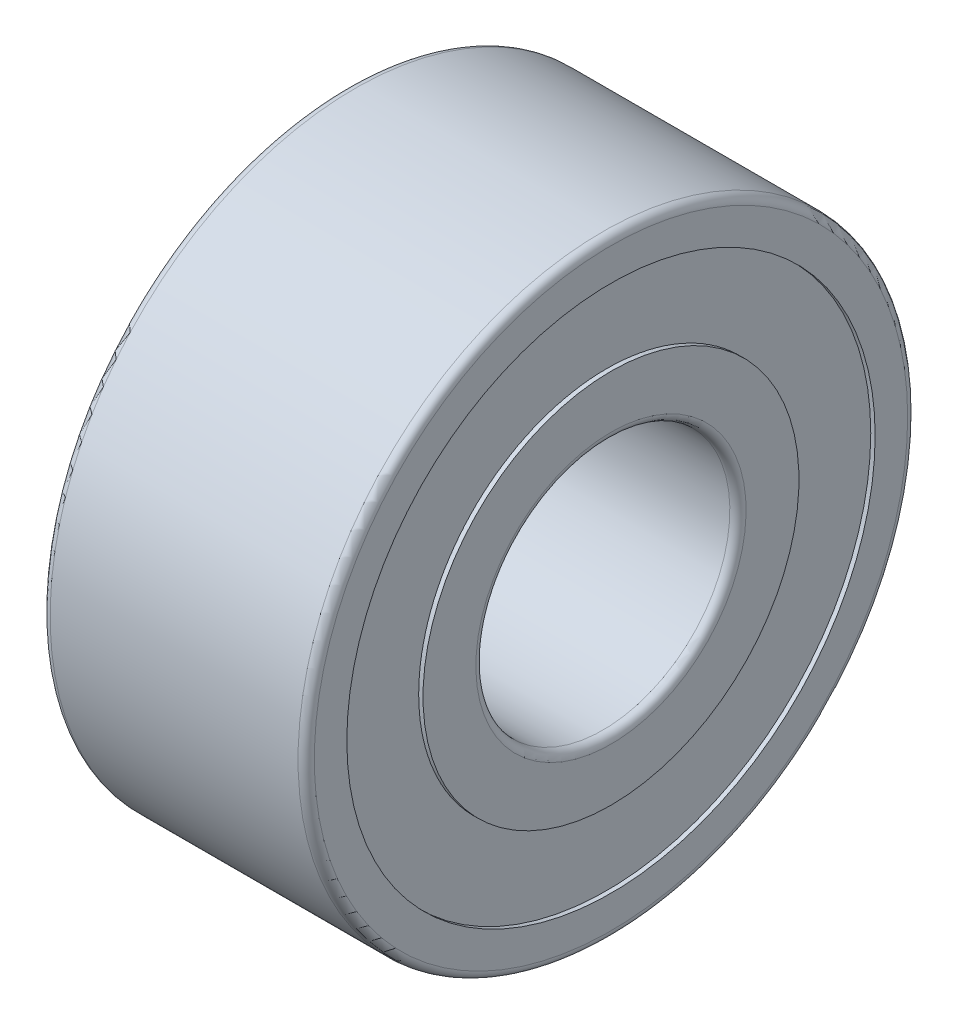
ISO-10303-21;
HEADER;
FILE_DESCRIPTION(('STEP AP214'),'2;1');
FILE_NAME('part.step','',(''),(''),'','','');
FILE_SCHEMA(('AUTOMOTIVE_DESIGN { 1 0 10303 214 1 1 1 1 }'));
ENDSEC;
DATA;
#1=APPLICATION_CONTEXT('core data for automotive mechanical design processes');
#2=APPLICATION_PROTOCOL_DEFINITION('international standard','automotive_design',2000,#1);
#3=PRODUCT_CONTEXT('',#1,'mechanical');
#4=PRODUCT('Part','Part','',(#3));
#5=PRODUCT_RELATED_PRODUCT_CATEGORY('part','',(#4));
#6=PRODUCT_DEFINITION_FORMATION('','',#4);
#7=PRODUCT_DEFINITION_CONTEXT('part definition',#1,'design');
#8=PRODUCT_DEFINITION('design','',#6,#7);
#9=PRODUCT_DEFINITION_SHAPE('','',#8);
#10=(LENGTH_UNIT() NAMED_UNIT(*) SI_UNIT(.MILLI.,.METRE.));
#11=(NAMED_UNIT(*) PLANE_ANGLE_UNIT() SI_UNIT($,.RADIAN.));
#12=(NAMED_UNIT(*) SI_UNIT($,.STERADIAN.) SOLID_ANGLE_UNIT());
#13=UNCERTAINTY_MEASURE_WITH_UNIT(LENGTH_MEASURE(1.E-05),#10,'distance_accuracy_value','');
#14=(GEOMETRIC_REPRESENTATION_CONTEXT(3) GLOBAL_UNCERTAINTY_ASSIGNED_CONTEXT((#13)) GLOBAL_UNIT_ASSIGNED_CONTEXT((#10,
#11,#12)) REPRESENTATION_CONTEXT('',''));
#15=CARTESIAN_POINT('',(0.,0.,0.));
#16=DIRECTION('',(0.,0.,1.));
#17=DIRECTION('',(1.,0.,0.));
#18=AXIS2_PLACEMENT_3D('',#15,#16,#17);
#19=CARTESIAN_POINT('',(1.3,0.,2.125));
#20=DIRECTION('',(1.,0.,0.));
#21=DIRECTION('',(0.,0.,-1.));
#22=AXIS2_PLACEMENT_3D('',#19,#20,#21);
#23=SPHERICAL_SURFACE('',#22,0.525);
#24=CARTESIAN_POINT('',(0.775,0.,2.125));
#25=VERTEX_POINT('',#24);
#26=VERTEX_LOOP('',#25);
#27=FACE_BOUND('',#26,.T.);
#28=CARTESIAN_POINT('',(1.825,0.,2.125));
#29=VERTEX_POINT('',#28);
#30=VERTEX_LOOP('',#29);
#31=FACE_BOUND('',#30,.T.);
#32=ADVANCED_FACE('P0_F15',(#27,#31),#23,.T.);
#33=CLOSED_SHELL('',(#32));
#34=MANIFOLD_SOLID_BREP('P0_B1',#33);
#35=CARTESIAN_POINT('',(1.3,1.2490436611215,1.7191611130468));
#36=DIRECTION('',(1.,0.,0.));
#37=DIRECTION('',(0.,0.,-1.));
#38=AXIS2_PLACEMENT_3D('',#35,#36,#37);
#39=SPHERICAL_SURFACE('',#38,0.525);
#40=CARTESIAN_POINT('',(0.775,1.2490436611215,1.7191611130468));
#41=VERTEX_POINT('',#40);
#42=VERTEX_LOOP('',#41);
#43=FACE_BOUND('',#42,.T.);
#44=CARTESIAN_POINT('',(1.825,1.2490436611215,1.7191611130468));
#45=VERTEX_POINT('',#44);
#46=VERTEX_LOOP('',#45);
#47=FACE_BOUND('',#46,.T.);
#48=ADVANCED_FACE('P1_F15',(#43,#47),#39,.T.);
#49=CLOSED_SHELL('',(#48));
#50=MANIFOLD_SOLID_BREP('P1_B1',#49);
#51=CARTESIAN_POINT('',(1.3,-1.2490436611215,1.7191611130468));
#52=DIRECTION('',(1.,0.,0.));
#53=DIRECTION('',(0.,0.,-1.));
#54=AXIS2_PLACEMENT_3D('',#51,#52,#53);
#55=SPHERICAL_SURFACE('',#54,0.525);
#56=CARTESIAN_POINT('',(0.775,-1.2490436611215,1.7191611130468));
#57=VERTEX_POINT('',#56);
#58=VERTEX_LOOP('',#57);
#59=FACE_BOUND('',#58,.T.);
#60=CARTESIAN_POINT('',(1.825,-1.2490436611215,1.7191611130468));
#61=VERTEX_POINT('',#60);
#62=VERTEX_LOOP('',#61);
#63=FACE_BOUND('',#62,.T.);
#64=ADVANCED_FACE('P2_F15',(#59,#63),#55,.T.);
#65=CLOSED_SHELL('',(#64));
#66=MANIFOLD_SOLID_BREP('P2_B1',#65);
#67=CARTESIAN_POINT('',(1.3,-2.0209950971272,0.65666111304676));
#68=DIRECTION('',(1.,0.,0.));
#69=DIRECTION('',(0.,0.,-1.));
#70=AXIS2_PLACEMENT_3D('',#67,#68,#69);
#71=SPHERICAL_SURFACE('',#70,0.525);
#72=CARTESIAN_POINT('',(0.775,-2.0209950971272,0.65666111304676));
#73=VERTEX_POINT('',#72);
#74=VERTEX_LOOP('',#73);
#75=FACE_BOUND('',#74,.T.);
#76=CARTESIAN_POINT('',(1.825,-2.0209950971272,0.65666111304676));
#77=VERTEX_POINT('',#76);
#78=VERTEX_LOOP('',#77);
#79=FACE_BOUND('',#78,.T.);
#80=ADVANCED_FACE('P3_F15',(#75,#79),#71,.T.);
#81=CLOSED_SHELL('',(#80));
#82=MANIFOLD_SOLID_BREP('P3_B1',#81);
#83=CARTESIAN_POINT('',(1.3,-2.0209950971272,-0.65666111304676));
#84=DIRECTION('',(1.,0.,0.));
#85=DIRECTION('',(0.,0.,-1.));
#86=AXIS2_PLACEMENT_3D('',#83,#84,#85);
#87=SPHERICAL_SURFACE('',#86,0.525);
#88=CARTESIAN_POINT('',(0.775,-2.0209950971272,-0.65666111304676));
#89=VERTEX_POINT('',#88);
#90=VERTEX_LOOP('',#89);
#91=FACE_BOUND('',#90,.T.);
#92=CARTESIAN_POINT('',(1.825,-2.0209950971272,-0.65666111304676));
#93=VERTEX_POINT('',#92);
#94=VERTEX_LOOP('',#93);
#95=FACE_BOUND('',#94,.T.);
#96=ADVANCED_FACE('P4_F15',(#91,#95),#87,.T.);
#97=CLOSED_SHELL('',(#96));
#98=MANIFOLD_SOLID_BREP('P4_B1',#97);
#99=CARTESIAN_POINT('',(1.3,-1.2490436611215,-1.7191611130468));
#100=DIRECTION('',(1.,0.,0.));
#101=DIRECTION('',(0.,0.,-1.));
#102=AXIS2_PLACEMENT_3D('',#99,#100,#101);
#103=SPHERICAL_SURFACE('',#102,0.525);
#104=CARTESIAN_POINT('',(0.775,-1.2490436611215,-1.7191611130468));
#105=VERTEX_POINT('',#104);
#106=VERTEX_LOOP('',#105);
#107=FACE_BOUND('',#106,.T.);
#108=CARTESIAN_POINT('',(1.825,-1.2490436611215,-1.7191611130468));
#109=VERTEX_POINT('',#108);
#110=VERTEX_LOOP('',#109);
#111=FACE_BOUND('',#110,.T.);
#112=ADVANCED_FACE('P5_F15',(#107,#111),#103,.T.);
#113=CLOSED_SHELL('',(#112));
#114=MANIFOLD_SOLID_BREP('P5_B1',#113);
#115=CARTESIAN_POINT('',(1.3,0.,-2.125));
#116=DIRECTION('',(1.,0.,0.));
#117=DIRECTION('',(0.,0.,-1.));
#118=AXIS2_PLACEMENT_3D('',#115,#116,#117);
#119=SPHERICAL_SURFACE('',#118,0.525);
#120=CARTESIAN_POINT('',(0.775,0.,-2.125));
#121=VERTEX_POINT('',#120);
#122=VERTEX_LOOP('',#121);
#123=FACE_BOUND('',#122,.T.);
#124=CARTESIAN_POINT('',(1.825,0.,-2.125));
#125=VERTEX_POINT('',#124);
#126=VERTEX_LOOP('',#125);
#127=FACE_BOUND('',#126,.T.);
#128=ADVANCED_FACE('P6_F15',(#123,#127),#119,.T.);
#129=CLOSED_SHELL('',(#128));
#130=MANIFOLD_SOLID_BREP('P6_B1',#129);
#131=CARTESIAN_POINT('',(1.3,1.2490436611215,-1.7191611130468));
#132=DIRECTION('',(1.,0.,0.));
#133=DIRECTION('',(0.,0.,-1.));
#134=AXIS2_PLACEMENT_3D('',#131,#132,#133);
#135=SPHERICAL_SURFACE('',#134,0.525);
#136=CARTESIAN_POINT('',(0.775,1.2490436611215,-1.7191611130468));
#137=VERTEX_POINT('',#136);
#138=VERTEX_LOOP('',#137);
#139=FACE_BOUND('',#138,.T.);
#140=CARTESIAN_POINT('',(1.825,1.2490436611215,-1.7191611130468));
#141=VERTEX_POINT('',#140);
#142=VERTEX_LOOP('',#141);
#143=FACE_BOUND('',#142,.T.);
#144=ADVANCED_FACE('P7_F15',(#139,#143),#135,.T.);
#145=CLOSED_SHELL('',(#144));
#146=MANIFOLD_SOLID_BREP('P7_B1',#145);
#147=CARTESIAN_POINT('',(1.3,2.0209950971272,-0.65666111304676));
#148=DIRECTION('',(1.,0.,0.));
#149=DIRECTION('',(0.,0.,-1.));
#150=AXIS2_PLACEMENT_3D('',#147,#148,#149);
#151=SPHERICAL_SURFACE('',#150,0.525);
#152=CARTESIAN_POINT('',(0.775,2.0209950971272,-0.65666111304676));
#153=VERTEX_POINT('',#152);
#154=VERTEX_LOOP('',#153);
#155=FACE_BOUND('',#154,.T.);
#156=CARTESIAN_POINT('',(1.825,2.0209950971272,-0.65666111304676));
#157=VERTEX_POINT('',#156);
#158=VERTEX_LOOP('',#157);
#159=FACE_BOUND('',#158,.T.);
#160=ADVANCED_FACE('P8_F15',(#155,#159),#151,.T.);
#161=CLOSED_SHELL('',(#160));
#162=MANIFOLD_SOLID_BREP('P8_B1',#161);
#163=CARTESIAN_POINT('',(1.3,2.0209950971272,0.65666111304676));
#164=DIRECTION('',(1.,0.,0.));
#165=DIRECTION('',(0.,0.,-1.));
#166=AXIS2_PLACEMENT_3D('',#163,#164,#165);
#167=SPHERICAL_SURFACE('',#166,0.525);
#168=CARTESIAN_POINT('',(0.775,2.0209950971272,0.65666111304676));
#169=VERTEX_POINT('',#168);
#170=VERTEX_LOOP('',#169);
#171=FACE_BOUND('',#170,.T.);
#172=CARTESIAN_POINT('',(1.825,2.0209950971272,0.65666111304676));
#173=VERTEX_POINT('',#172);
#174=VERTEX_LOOP('',#173);
#175=FACE_BOUND('',#174,.T.);
#176=ADVANCED_FACE('P9_F15',(#171,#175),#167,.T.);
#177=CLOSED_SHELL('',(#176));
#178=MANIFOLD_SOLID_BREP('P9_B1',#177);
#179=CARTESIAN_POINT('',(0.,0.,1.85));
#180=DIRECTION('',(-1.,0.,0.));
#181=DIRECTION('',(0.,-1.,0.));
#182=AXIS2_PLACEMENT_3D('',#179,#180,#181);
#183=PLANE('',#182);
#184=CARTESIAN_POINT('',(0.,0.,0.));
#185=DIRECTION('',(1.,0.,0.));
#186=DIRECTION('',(0.,1.,0.));
#187=AXIS2_PLACEMENT_3D('',#184,#185,#186);
#188=CIRCLE('',#187,1.33000000000004);
#189=CARTESIAN_POINT('',(0.,1.33000000000004,0.));
#190=VERTEX_POINT('',#189);
#191=EDGE_CURVE('P10_E44',#190,#190,#188,.T.);
#192=ORIENTED_EDGE('',*,*,#191,.T.);
#193=EDGE_LOOP('',(#192));
#194=FACE_BOUND('',#193,.T.);
#195=CARTESIAN_POINT('',(0.,0.,0.));
#196=DIRECTION('',(1.,0.,0.));
#197=DIRECTION('',(0.,1.,0.));
#198=AXIS2_PLACEMENT_3D('',#195,#196,#197);
#199=CIRCLE('',#198,1.85);
#200=CARTESIAN_POINT('',(0.,1.85,0.));
#201=VERTEX_POINT('',#200);
#202=EDGE_CURVE('P10_E41',#201,#201,#199,.T.);
#203=ORIENTED_EDGE('',*,*,#202,.F.);
#204=EDGE_LOOP('',(#203));
#205=FACE_BOUND('',#204,.T.);
#206=ADVANCED_FACE('P10_F15',(#194,#205),#183,.T.);
#207=CARTESIAN_POINT('',(0.0800000000000401,0.,0.));
#208=DIRECTION('',(1.,0.,0.));
#209=DIRECTION('',(0.,1.,0.));
#210=AXIS2_PLACEMENT_3D('',#207,#208,#209);
#211=TOROIDAL_SURFACE('',#210,1.33000000000004,0.0800000000000401);
#212=CARTESIAN_POINT('',(0.08,0.,0.));
#213=DIRECTION('',(1.,0.,0.));
#214=DIRECTION('',(0.,1.,0.));
#215=AXIS2_PLACEMENT_3D('',#212,#213,#214);
#216=CIRCLE('',#215,1.25);
#217=CARTESIAN_POINT('',(0.08,1.25,0.));
#218=VERTEX_POINT('',#217);
#219=EDGE_CURVE('P10_E38',#218,#218,#216,.T.);
#220=ORIENTED_EDGE('',*,*,#219,.T.);
#221=EDGE_LOOP('',(#220));
#222=FACE_BOUND('',#221,.T.);
#223=ORIENTED_EDGE('',*,*,#191,.F.);
#224=EDGE_LOOP('',(#223));
#225=FACE_BOUND('',#224,.T.);
#226=ADVANCED_FACE('P10_F50',(#222,#225),#211,.T.);
#227=CARTESIAN_POINT('',(2.6,0.,0.));
#228=DIRECTION('',(1.,0.,0.));
#229=DIRECTION('',(0.,1.,0.));
#230=AXIS2_PLACEMENT_3D('',#227,#228,#229);
#231=CYLINDRICAL_SURFACE('',#230,1.85);
#232=ORIENTED_EDGE('',*,*,#202,.T.);
#233=EDGE_LOOP('',(#232));
#234=FACE_BOUND('',#233,.T.);
#235=CARTESIAN_POINT('',(0.85278640450004,0.,0.));
#236=DIRECTION('',(1.,0.,0.));
#237=DIRECTION('',(0.,1.,0.));
#238=AXIS2_PLACEMENT_3D('',#235,#236,#237);
#239=CIRCLE('',#238,1.85);
#240=CARTESIAN_POINT('',(0.85278640450004,1.85,0.));
#241=VERTEX_POINT('',#240);
#242=EDGE_CURVE('P10_E35',#241,#241,#239,.T.);
#243=ORIENTED_EDGE('',*,*,#242,.F.);
#244=EDGE_LOOP('',(#243));
#245=FACE_BOUND('',#244,.T.);
#246=ADVANCED_FACE('P10_F52',(#234,#245),#231,.T.);
#247=CARTESIAN_POINT('',(2.6,0.,0.));
#248=DIRECTION('',(1.,0.,0.));
#249=DIRECTION('',(0.,1.,0.));
#250=AXIS2_PLACEMENT_3D('',#247,#248,#249);
#251=CYLINDRICAL_SURFACE('',#250,1.25);
#252=CARTESIAN_POINT('',(2.52,0.,0.));
#253=DIRECTION('',(1.,0.,0.));
#254=DIRECTION('',(0.,1.,0.));
#255=AXIS2_PLACEMENT_3D('',#252,#253,#254);
#256=CIRCLE('',#255,1.25);
#257=CARTESIAN_POINT('',(2.52,1.25,0.));
#258=VERTEX_POINT('',#257);
#259=EDGE_CURVE('P10_E30',#258,#258,#256,.T.);
#260=ORIENTED_EDGE('',*,*,#259,.T.);
#261=EDGE_LOOP('',(#260));
#262=FACE_BOUND('',#261,.T.);
#263=ORIENTED_EDGE('',*,*,#219,.F.);
#264=EDGE_LOOP('',(#263));
#265=FACE_BOUND('',#264,.T.);
#266=ADVANCED_FACE('P10_F60',(#262,#265),#251,.F.);
#267=CARTESIAN_POINT('',(1.30000000000002,0.,0.));
#268=DIRECTION('',(1.,0.,0.));
#269=DIRECTION('',(0.,1.,0.));
#270=AXIS2_PLACEMENT_3D('',#267,#268,#269);
#271=TOROIDAL_SURFACE('',#270,2.12500000000004,0.52500000000004);
#272=CARTESIAN_POINT('',(1.7472135955,0.,0.));
#273=DIRECTION('',(1.,0.,0.));
#274=DIRECTION('',(0.,1.,0.));
#275=AXIS2_PLACEMENT_3D('',#272,#273,#274);
#276=CIRCLE('',#275,1.85);
#277=CARTESIAN_POINT('',(1.7472135955,1.85,0.));
#278=VERTEX_POINT('',#277);
#279=EDGE_CURVE('P10_E26',#278,#278,#276,.T.);
#280=ORIENTED_EDGE('',*,*,#279,.F.);
#281=EDGE_LOOP('',(#280));
#282=FACE_BOUND('',#281,.T.);
#283=ORIENTED_EDGE('',*,*,#242,.T.);
#284=EDGE_LOOP('',(#283));
#285=FACE_BOUND('',#284,.T.);
#286=ADVANCED_FACE('P10_F67',(#282,#285),#271,.F.);
#287=CARTESIAN_POINT('',(2.51999999999992,0.,0.));
#288=DIRECTION('',(1.,0.,0.));
#289=DIRECTION('',(0.,1.,0.));
#290=AXIS2_PLACEMENT_3D('',#287,#288,#289);
#291=TOROIDAL_SURFACE('',#290,1.33000000000008,0.0800000000000813);
#292=CARTESIAN_POINT('',(2.6,0.,0.));
#293=DIRECTION('',(1.,0.,0.));
#294=DIRECTION('',(0.,1.,0.));
#295=AXIS2_PLACEMENT_3D('',#292,#293,#294);
#296=CIRCLE('',#295,1.32999998564538);
#297=CARTESIAN_POINT('',(2.6,1.32999998564538,0.));
#298=VERTEX_POINT('',#297);
#299=EDGE_CURVE('P10_E22',#298,#298,#296,.T.);
#300=ORIENTED_EDGE('',*,*,#299,.T.);
#301=EDGE_LOOP('',(#300));
#302=FACE_BOUND('',#301,.T.);
#303=ORIENTED_EDGE('',*,*,#259,.F.);
#304=EDGE_LOOP('',(#303));
#305=FACE_BOUND('',#304,.T.);
#306=ADVANCED_FACE('P10_F71',(#302,#305),#291,.T.);
#307=CARTESIAN_POINT('',(2.6,0.,0.));
#308=DIRECTION('',(1.,0.,0.));
#309=DIRECTION('',(0.,1.,0.));
#310=AXIS2_PLACEMENT_3D('',#307,#308,#309);
#311=CYLINDRICAL_SURFACE('',#310,1.85);
#312=ORIENTED_EDGE('',*,*,#279,.T.);
#313=EDGE_LOOP('',(#312));
#314=FACE_BOUND('',#313,.T.);
#315=CARTESIAN_POINT('',(2.6,0.,0.));
#316=DIRECTION('',(1.,0.,0.));
#317=DIRECTION('',(0.,1.,0.));
#318=AXIS2_PLACEMENT_3D('',#315,#316,#317);
#319=CIRCLE('',#318,1.85);
#320=CARTESIAN_POINT('',(2.6,1.85,0.));
#321=VERTEX_POINT('',#320);
#322=EDGE_CURVE('P10_E10',#321,#321,#319,.T.);
#323=ORIENTED_EDGE('',*,*,#322,.F.);
#324=EDGE_LOOP('',(#323));
#325=FACE_BOUND('',#324,.T.);
#326=ADVANCED_FACE('P10_F74',(#314,#325),#311,.T.);
#327=CARTESIAN_POINT('',(2.6,0.,1.33));
#328=DIRECTION('',(1.,0.,0.));
#329=DIRECTION('',(0.,1.,0.));
#330=AXIS2_PLACEMENT_3D('',#327,#328,#329);
#331=PLANE('',#330);
#332=ORIENTED_EDGE('',*,*,#322,.T.);
#333=EDGE_LOOP('',(#332));
#334=FACE_BOUND('',#333,.T.);
#335=ORIENTED_EDGE('',*,*,#299,.F.);
#336=EDGE_LOOP('',(#335));
#337=FACE_BOUND('',#336,.T.);
#338=ADVANCED_FACE('P10_F17',(#334,#337),#331,.T.);
#339=CLOSED_SHELL('',(#206,#226,#246,#266,#286,#306,#326,#338));
#340=MANIFOLD_SOLID_BREP('P10_B1',#339);
#341=CARTESIAN_POINT('',(0.,2.92,0.));
#342=DIRECTION('',(-1.,0.,0.));
#343=DIRECTION('',(0.,0.,1.));
#344=AXIS2_PLACEMENT_3D('',#341,#342,#343);
#345=PLANE('',#344);
#346=CARTESIAN_POINT('',(0.,0.,0.));
#347=DIRECTION('',(1.,0.,0.));
#348=DIRECTION('',(0.,0.,-1.));
#349=AXIS2_PLACEMENT_3D('',#346,#347,#348);
#350=CIRCLE('',#349,2.6);
#351=CARTESIAN_POINT('',(0.,0.,-2.6));
#352=VERTEX_POINT('',#351);
#353=EDGE_CURVE('P11_E56',#352,#352,#350,.T.);
#354=ORIENTED_EDGE('',*,*,#353,.T.);
#355=EDGE_LOOP('',(#354));
#356=FACE_BOUND('',#355,.T.);
#357=CARTESIAN_POINT('',(0.,0.,0.));
#358=DIRECTION('',(1.,0.,0.));
#359=DIRECTION('',(0.,0.,-1.));
#360=AXIS2_PLACEMENT_3D('',#357,#358,#359);
#361=CIRCLE('',#360,2.91999999999996);
#362=CARTESIAN_POINT('',(0.,0.,-2.91999999999996));
#363=VERTEX_POINT('',#362);
#364=EDGE_CURVE('P11_E53',#363,#363,#361,.T.);
#365=ORIENTED_EDGE('',*,*,#364,.F.);
#366=EDGE_LOOP('',(#365));
#367=FACE_BOUND('',#366,.T.);
#368=ADVANCED_FACE('P11_F15',(#356,#367),#345,.T.);
#369=CARTESIAN_POINT('',(2.6,0.,0.));
#370=DIRECTION('',(1.,0.,0.));
#371=DIRECTION('',(0.,0.,-1.));
#372=AXIS2_PLACEMENT_3D('',#369,#370,#371);
#373=CYLINDRICAL_SURFACE('',#372,2.6);
#374=CARTESIAN_POINT('',(0.17264,0.,0.));
#375=DIRECTION('',(1.,0.,0.));
#376=DIRECTION('',(0.,0.,-1.));
#377=AXIS2_PLACEMENT_3D('',#374,#375,#376);
#378=CIRCLE('',#377,2.6);
#379=CARTESIAN_POINT('',(0.17264,0.,-2.6));
#380=VERTEX_POINT('',#379);
#381=EDGE_CURVE('P11_E50',#380,#380,#378,.T.);
#382=ORIENTED_EDGE('',*,*,#381,.T.);
#383=EDGE_LOOP('',(#382));
#384=FACE_BOUND('',#383,.T.);
#385=ORIENTED_EDGE('',*,*,#353,.F.);
#386=EDGE_LOOP('',(#385));
#387=FACE_BOUND('',#386,.T.);
#388=ADVANCED_FACE('P11_F62',(#384,#387),#373,.F.);
#389=CARTESIAN_POINT('',(0.0800000000000406,0.,0.));
#390=DIRECTION('',(1.,0.,0.));
#391=DIRECTION('',(0.,0.,-1.));
#392=AXIS2_PLACEMENT_3D('',#389,#390,#391);
#393=TOROIDAL_SURFACE('',#392,2.91999999999996,0.0800000000000405);
#394=ORIENTED_EDGE('',*,*,#364,.T.);
#395=EDGE_LOOP('',(#394));
#396=FACE_BOUND('',#395,.T.);
#397=CARTESIAN_POINT('',(0.0800000000000001,0.,0.));
#398=DIRECTION('',(1.,0.,0.));
#399=DIRECTION('',(0.,0.,-1.));
#400=AXIS2_PLACEMENT_3D('',#397,#398,#399);
#401=CIRCLE('',#400,3.);
#402=CARTESIAN_POINT('',(0.0800000000000001,0.,-3.));
#403=VERTEX_POINT('',#402);
#404=EDGE_CURVE('P11_E47',#403,#403,#401,.T.);
#405=ORIENTED_EDGE('',*,*,#404,.F.);
#406=EDGE_LOOP('',(#405));
#407=FACE_BOUND('',#406,.T.);
#408=ADVANCED_FACE('P11_F64',(#396,#407),#393,.T.);
#409=CARTESIAN_POINT('',(0.17264,2.6,0.));
#410=DIRECTION('',(-1.,0.,0.));
#411=DIRECTION('',(0.,0.,1.));
#412=AXIS2_PLACEMENT_3D('',#409,#410,#411);
#413=PLANE('',#412);
#414=CARTESIAN_POINT('',(0.17264,0.,0.));
#415=DIRECTION('',(1.,0.,0.));
#416=DIRECTION('',(0.,0.,-1.));
#417=AXIS2_PLACEMENT_3D('',#414,#415,#416);
#418=CIRCLE('',#417,2.45);
#419=CARTESIAN_POINT('',(0.17264,0.,-2.45));
#420=VERTEX_POINT('',#419);
#421=EDGE_CURVE('P11_E44',#420,#420,#418,.T.);
#422=ORIENTED_EDGE('',*,*,#421,.T.);
#423=EDGE_LOOP('',(#422));
#424=FACE_BOUND('',#423,.T.);
#425=ORIENTED_EDGE('',*,*,#381,.F.);
#426=EDGE_LOOP('',(#425));
#427=FACE_BOUND('',#426,.T.);
#428=ADVANCED_FACE('P11_F73',(#424,#427),#413,.T.);
#429=CARTESIAN_POINT('',(2.6,0.,0.));
#430=DIRECTION('',(1.,0.,0.));
#431=DIRECTION('',(0.,0.,-1.));
#432=AXIS2_PLACEMENT_3D('',#429,#430,#431);
#433=CYLINDRICAL_SURFACE('',#432,3.);
#434=ORIENTED_EDGE('',*,*,#404,.T.);
#435=EDGE_LOOP('',(#434));
#436=FACE_BOUND('',#435,.T.);
#437=CARTESIAN_POINT('',(2.52,0.,0.));
#438=DIRECTION('',(1.,0.,0.));
#439=DIRECTION('',(0.,0.,-1.));
#440=AXIS2_PLACEMENT_3D('',#437,#438,#439);
#441=CIRCLE('',#440,3.);
#442=CARTESIAN_POINT('',(2.52,0.,-3.));
#443=VERTEX_POINT('',#442);
#444=EDGE_CURVE('P11_E41',#443,#443,#441,.T.);
#445=ORIENTED_EDGE('',*,*,#444,.F.);
#446=EDGE_LOOP('',(#445));
#447=FACE_BOUND('',#446,.T.);
#448=ADVANCED_FACE('P11_F80',(#436,#447),#433,.T.);
#449=CARTESIAN_POINT('',(2.6,0.,0.));
#450=DIRECTION('',(1.,0.,0.));
#451=DIRECTION('',(0.,0.,-1.));
#452=AXIS2_PLACEMENT_3D('',#449,#450,#451);
#453=CYLINDRICAL_SURFACE('',#452,2.45);
#454=CARTESIAN_POINT('',(0.88768943743823,0.,0.));
#455=DIRECTION('',(1.,0.,0.));
#456=DIRECTION('',(0.,0.,-1.));
#457=AXIS2_PLACEMENT_3D('',#454,#455,#456);
#458=CIRCLE('',#457,2.45);
#459=CARTESIAN_POINT('',(0.88768943743823,0.,-2.45));
#460=VERTEX_POINT('',#459);
#461=EDGE_CURVE('P11_E38',#460,#460,#458,.T.);
#462=ORIENTED_EDGE('',*,*,#461,.T.);
#463=EDGE_LOOP('',(#462));
#464=FACE_BOUND('',#463,.T.);
#465=ORIENTED_EDGE('',*,*,#421,.F.);
#466=EDGE_LOOP('',(#465));
#467=FACE_BOUND('',#466,.T.);
#468=ADVANCED_FACE('P11_F84',(#464,#467),#453,.F.);
#469=CARTESIAN_POINT('',(2.51999999999992,0.,0.));
#470=DIRECTION('',(1.,0.,0.));
#471=DIRECTION('',(0.,0.,-1.));
#472=AXIS2_PLACEMENT_3D('',#469,#470,#471);
#473=TOROIDAL_SURFACE('',#472,2.91999999999992,0.0800000000000817);
#474=ORIENTED_EDGE('',*,*,#444,.T.);
#475=EDGE_LOOP('',(#474));
#476=FACE_BOUND('',#475,.T.);
#477=CARTESIAN_POINT('',(2.6,0.,0.));
#478=DIRECTION('',(1.,0.,0.));
#479=DIRECTION('',(0.,0.,-1.));
#480=AXIS2_PLACEMENT_3D('',#477,#478,#479);
#481=CIRCLE('',#480,2.92000001647497);
#482=CARTESIAN_POINT('',(2.6,0.,-2.92000001647497));
#483=VERTEX_POINT('',#482);
#484=EDGE_CURVE('P11_E35',#483,#483,#481,.T.);
#485=ORIENTED_EDGE('',*,*,#484,.F.);
#486=EDGE_LOOP('',(#485));
#487=FACE_BOUND('',#486,.T.);
#488=ADVANCED_FACE('P11_F88',(#476,#487),#473,.T.);
#489=CARTESIAN_POINT('',(1.30000000000001,0.,0.));
#490=DIRECTION('',(1.,0.,0.));
#491=DIRECTION('',(0.,0.,-1.));
#492=AXIS2_PLACEMENT_3D('',#489,#490,#491);
#493=TOROIDAL_SURFACE('',#492,2.12499999999996,0.52500000000004);
#494=ORIENTED_EDGE('',*,*,#461,.F.);
#495=EDGE_LOOP('',(#494));
#496=FACE_BOUND('',#495,.T.);
#497=CARTESIAN_POINT('',(1.7123105625618,0.,0.));
#498=DIRECTION('',(1.,0.,0.));
#499=DIRECTION('',(0.,0.,-1.));
#500=AXIS2_PLACEMENT_3D('',#497,#498,#499);
#501=CIRCLE('',#500,2.45);
#502=CARTESIAN_POINT('',(1.7123105625618,0.,-2.45));
#503=VERTEX_POINT('',#502);
#504=EDGE_CURVE('P11_E30',#503,#503,#501,.T.);
#505=ORIENTED_EDGE('',*,*,#504,.T.);
#506=EDGE_LOOP('',(#505));
#507=FACE_BOUND('',#506,.T.);
#508=ADVANCED_FACE('P11_F92',(#496,#507),#493,.F.);
#509=CARTESIAN_POINT('',(2.6,2.6,0.));
#510=DIRECTION('',(1.,0.,0.));
#511=DIRECTION('',(0.,0.,-1.));
#512=AXIS2_PLACEMENT_3D('',#509,#510,#511);
#513=PLANE('',#512);
#514=ORIENTED_EDGE('',*,*,#484,.T.);
#515=EDGE_LOOP('',(#514));
#516=FACE_BOUND('',#515,.T.);
#517=CARTESIAN_POINT('',(2.6,0.,0.));
#518=DIRECTION('',(1.,0.,0.));
#519=DIRECTION('',(0.,0.,-1.));
#520=AXIS2_PLACEMENT_3D('',#517,#518,#519);
#521=CIRCLE('',#520,2.6);
#522=CARTESIAN_POINT('',(2.6,0.,-2.6));
#523=VERTEX_POINT('',#522);
#524=EDGE_CURVE('P11_E26',#523,#523,#521,.T.);
#525=ORIENTED_EDGE('',*,*,#524,.F.);
#526=EDGE_LOOP('',(#525));
#527=FACE_BOUND('',#526,.T.);
#528=ADVANCED_FACE('P11_F96',(#516,#527),#513,.T.);
#529=CARTESIAN_POINT('',(2.6,0.,0.));
#530=DIRECTION('',(1.,0.,0.));
#531=DIRECTION('',(0.,0.,-1.));
#532=AXIS2_PLACEMENT_3D('',#529,#530,#531);
#533=CYLINDRICAL_SURFACE('',#532,2.45);
#534=CARTESIAN_POINT('',(2.42736,0.,0.));
#535=DIRECTION('',(1.,0.,0.));
#536=DIRECTION('',(0.,0.,-1.));
#537=AXIS2_PLACEMENT_3D('',#534,#535,#536);
#538=CIRCLE('',#537,2.45);
#539=CARTESIAN_POINT('',(2.42736,0.,-2.45));
#540=VERTEX_POINT('',#539);
#541=EDGE_CURVE('P11_E22',#540,#540,#538,.T.);
#542=ORIENTED_EDGE('',*,*,#541,.T.);
#543=EDGE_LOOP('',(#542));
#544=FACE_BOUND('',#543,.T.);
#545=ORIENTED_EDGE('',*,*,#504,.F.);
#546=EDGE_LOOP('',(#545));
#547=FACE_BOUND('',#546,.T.);
#548=ADVANCED_FACE('P11_F100',(#544,#547),#533,.F.);
#549=CARTESIAN_POINT('',(2.6,0.,0.));
#550=DIRECTION('',(1.,0.,0.));
#551=DIRECTION('',(0.,0.,-1.));
#552=AXIS2_PLACEMENT_3D('',#549,#550,#551);
#553=CYLINDRICAL_SURFACE('',#552,2.6);
#554=ORIENTED_EDGE('',*,*,#524,.T.);
#555=EDGE_LOOP('',(#554));
#556=FACE_BOUND('',#555,.T.);
#557=CARTESIAN_POINT('',(2.42736,0.,0.));
#558=DIRECTION('',(1.,0.,0.));
#559=DIRECTION('',(0.,0.,-1.));
#560=AXIS2_PLACEMENT_3D('',#557,#558,#559);
#561=CIRCLE('',#560,2.6);
#562=CARTESIAN_POINT('',(2.42736,0.,-2.6));
#563=VERTEX_POINT('',#562);
#564=EDGE_CURVE('P11_E10',#563,#563,#561,.T.);
#565=ORIENTED_EDGE('',*,*,#564,.F.);
#566=EDGE_LOOP('',(#565));
#567=FACE_BOUND('',#566,.T.);
#568=ADVANCED_FACE('P11_F103',(#556,#567),#553,.F.);
#569=CARTESIAN_POINT('',(2.42736,2.45,0.));
#570=DIRECTION('',(1.,0.,0.));
#571=DIRECTION('',(0.,0.,-1.));
#572=AXIS2_PLACEMENT_3D('',#569,#570,#571);
#573=PLANE('',#572);
#574=ORIENTED_EDGE('',*,*,#564,.T.);
#575=EDGE_LOOP('',(#574));
#576=FACE_BOUND('',#575,.T.);
#577=ORIENTED_EDGE('',*,*,#541,.F.);
#578=EDGE_LOOP('',(#577));
#579=FACE_BOUND('',#578,.T.);
#580=ADVANCED_FACE('P11_F17',(#576,#579),#573,.T.);
#581=CLOSED_SHELL('',(#368,#388,#408,#428,#448,#468,#488,#508,#528,#548,#568,#580));
#582=MANIFOLD_SOLID_BREP('P11_B1',#581);
#583=CARTESIAN_POINT('',(0.17264,0.,-2.6));
#584=DIRECTION('',(1.,0.,0.));
#585=DIRECTION('',(0.,-1.,0.));
#586=AXIS2_PLACEMENT_3D('',#583,#584,#585);
#587=PLANE('',#586);
#588=CARTESIAN_POINT('',(0.17264,0.,0.));
#589=DIRECTION('',(-1.,0.,0.));
#590=DIRECTION('',(0.,1.,0.));
#591=AXIS2_PLACEMENT_3D('',#588,#589,#590);
#592=CIRCLE('',#591,1.85);
#593=CARTESIAN_POINT('',(0.17264,1.85,0.));
#594=VERTEX_POINT('',#593);
#595=EDGE_CURVE('P12_E30',#594,#594,#592,.T.);
#596=ORIENTED_EDGE('',*,*,#595,.T.);
#597=EDGE_LOOP('',(#596));
#598=FACE_BOUND('',#597,.T.);
#599=CARTESIAN_POINT('',(0.17264,0.,0.));
#600=DIRECTION('',(-1.,0.,0.));
#601=DIRECTION('',(0.,1.,0.));
#602=AXIS2_PLACEMENT_3D('',#599,#600,#601);
#603=CIRCLE('',#602,2.6);
#604=CARTESIAN_POINT('',(0.17264,2.6,0.));
#605=VERTEX_POINT('',#604);
#606=EDGE_CURVE('P12_E26',#605,#605,#603,.T.);
#607=ORIENTED_EDGE('',*,*,#606,.F.);
#608=EDGE_LOOP('',(#607));
#609=FACE_BOUND('',#608,.T.);
#610=ADVANCED_FACE('P12_F15',(#598,#609),#587,.T.);
#611=CARTESIAN_POINT('',(0.04316,0.,0.));
#612=DIRECTION('',(-1.,0.,0.));
#613=DIRECTION('',(0.,1.,0.));
#614=AXIS2_PLACEMENT_3D('',#611,#612,#613);
#615=CYLINDRICAL_SURFACE('',#614,1.85);
#616=CARTESIAN_POINT('',(0.04316,0.,0.));
#617=DIRECTION('',(-1.,0.,0.));
#618=DIRECTION('',(0.,1.,0.));
#619=AXIS2_PLACEMENT_3D('',#616,#617,#618);
#620=CIRCLE('',#619,1.85);
#621=CARTESIAN_POINT('',(0.04316,1.85,0.));
#622=VERTEX_POINT('',#621);
#623=EDGE_CURVE('P12_E22',#622,#622,#620,.T.);
#624=ORIENTED_EDGE('',*,*,#623,.T.);
#625=EDGE_LOOP('',(#624));
#626=FACE_BOUND('',#625,.T.);
#627=ORIENTED_EDGE('',*,*,#595,.F.);
#628=EDGE_LOOP('',(#627));
#629=FACE_BOUND('',#628,.T.);
#630=ADVANCED_FACE('P12_F38',(#626,#629),#615,.F.);
#631=CARTESIAN_POINT('',(0.04316,0.,0.));
#632=DIRECTION('',(-1.,0.,0.));
#633=DIRECTION('',(0.,1.,0.));
#634=AXIS2_PLACEMENT_3D('',#631,#632,#633);
#635=CYLINDRICAL_SURFACE('',#634,2.6);
#636=ORIENTED_EDGE('',*,*,#606,.T.);
#637=EDGE_LOOP('',(#636));
#638=FACE_BOUND('',#637,.T.);
#639=CARTESIAN_POINT('',(0.04316,0.,0.));
#640=DIRECTION('',(-1.,0.,0.));
#641=DIRECTION('',(0.,1.,0.));
#642=AXIS2_PLACEMENT_3D('',#639,#640,#641);
#643=CIRCLE('',#642,2.6);
#644=CARTESIAN_POINT('',(0.04316,2.6,0.));
#645=VERTEX_POINT('',#644);
#646=EDGE_CURVE('P12_E10',#645,#645,#643,.T.);
#647=ORIENTED_EDGE('',*,*,#646,.F.);
#648=EDGE_LOOP('',(#647));
#649=FACE_BOUND('',#648,.T.);
#650=ADVANCED_FACE('P12_F40',(#638,#649),#635,.T.);
#651=CARTESIAN_POINT('',(0.04316,0.,-1.85));
#652=DIRECTION('',(-1.,0.,0.));
#653=DIRECTION('',(0.,1.,0.));
#654=AXIS2_PLACEMENT_3D('',#651,#652,#653);
#655=PLANE('',#654);
#656=ORIENTED_EDGE('',*,*,#646,.T.);
#657=EDGE_LOOP('',(#656));
#658=FACE_BOUND('',#657,.T.);
#659=ORIENTED_EDGE('',*,*,#623,.F.);
#660=EDGE_LOOP('',(#659));
#661=FACE_BOUND('',#660,.T.);
#662=ADVANCED_FACE('P12_F17',(#658,#661),#655,.T.);
#663=CLOSED_SHELL('',(#610,#630,#650,#662));
#664=MANIFOLD_SOLID_BREP('P12_B1',#663);
#665=CARTESIAN_POINT('',(2.42736,2.6,0.));
#666=DIRECTION('',(-1.,0.,0.));
#667=DIRECTION('',(0.,0.,1.));
#668=AXIS2_PLACEMENT_3D('',#665,#666,#667);
#669=PLANE('',#668);
#670=CARTESIAN_POINT('',(2.42736,0.,0.));
#671=DIRECTION('',(1.,0.,0.));
#672=DIRECTION('',(0.,0.,-1.));
#673=AXIS2_PLACEMENT_3D('',#670,#671,#672);
#674=CIRCLE('',#673,1.85);
#675=CARTESIAN_POINT('',(2.42736,0.,-1.85));
#676=VERTEX_POINT('',#675);
#677=EDGE_CURVE('P13_E29',#676,#676,#674,.T.);
#678=ORIENTED_EDGE('',*,*,#677,.T.);
#679=EDGE_LOOP('',(#678));
#680=FACE_BOUND('',#679,.T.);
#681=CARTESIAN_POINT('',(2.42736,0.,0.));
#682=DIRECTION('',(1.,0.,0.));
#683=DIRECTION('',(0.,0.,-1.));
#684=AXIS2_PLACEMENT_3D('',#681,#682,#683);
#685=CIRCLE('',#684,2.6);
#686=CARTESIAN_POINT('',(2.42736,0.,-2.6));
#687=VERTEX_POINT('',#686);
#688=EDGE_CURVE('P13_E25',#687,#687,#685,.T.);
#689=ORIENTED_EDGE('',*,*,#688,.F.);
#690=EDGE_LOOP('',(#689));
#691=FACE_BOUND('',#690,.T.);
#692=ADVANCED_FACE('P13_F14',(#680,#691),#669,.T.);
#693=CARTESIAN_POINT('',(2.55684,0.,0.));
#694=DIRECTION('',(1.,0.,0.));
#695=DIRECTION('',(0.,0.,-1.));
#696=AXIS2_PLACEMENT_3D('',#693,#694,#695);
#697=CYLINDRICAL_SURFACE('',#696,1.85);
#698=CARTESIAN_POINT('',(2.55684,0.,0.));
#699=DIRECTION('',(1.,0.,0.));
#700=DIRECTION('',(0.,0.,-1.));
#701=AXIS2_PLACEMENT_3D('',#698,#699,#700);
#702=CIRCLE('',#701,1.85);
#703=CARTESIAN_POINT('',(2.55684,0.,-1.85));
#704=VERTEX_POINT('',#703);
#705=EDGE_CURVE('P13_E21',#704,#704,#702,.T.);
#706=ORIENTED_EDGE('',*,*,#705,.T.);
#707=EDGE_LOOP('',(#706));
#708=FACE_BOUND('',#707,.T.);
#709=ORIENTED_EDGE('',*,*,#677,.F.);
#710=EDGE_LOOP('',(#709));
#711=FACE_BOUND('',#710,.T.);
#712=ADVANCED_FACE('P13_F37',(#708,#711),#697,.F.);
#713=CARTESIAN_POINT('',(2.55684,0.,0.));
#714=DIRECTION('',(1.,0.,0.));
#715=DIRECTION('',(0.,0.,-1.));
#716=AXIS2_PLACEMENT_3D('',#713,#714,#715);
#717=CYLINDRICAL_SURFACE('',#716,2.6);
#718=ORIENTED_EDGE('',*,*,#688,.T.);
#719=EDGE_LOOP('',(#718));
#720=FACE_BOUND('',#719,.T.);
#721=CARTESIAN_POINT('',(2.55684,0.,0.));
#722=DIRECTION('',(1.,0.,0.));
#723=DIRECTION('',(0.,0.,-1.));
#724=AXIS2_PLACEMENT_3D('',#721,#722,#723);
#725=CIRCLE('',#724,2.6);
#726=CARTESIAN_POINT('',(2.55684,0.,-2.6));
#727=VERTEX_POINT('',#726);
#728=EDGE_CURVE('P13_E9',#727,#727,#725,.T.);
#729=ORIENTED_EDGE('',*,*,#728,.F.);
#730=EDGE_LOOP('',(#729));
#731=FACE_BOUND('',#730,.T.);
#732=ADVANCED_FACE('P13_F39',(#720,#731),#717,.T.);
#733=CARTESIAN_POINT('',(2.55684,1.85,0.));
#734=DIRECTION('',(1.,0.,0.));
#735=DIRECTION('',(0.,0.,-1.));
#736=AXIS2_PLACEMENT_3D('',#733,#734,#735);
#737=PLANE('',#736);
#738=ORIENTED_EDGE('',*,*,#728,.T.);
#739=EDGE_LOOP('',(#738));
#740=FACE_BOUND('',#739,.T.);
#741=ORIENTED_EDGE('',*,*,#705,.F.);
#742=EDGE_LOOP('',(#741));
#743=FACE_BOUND('',#742,.T.);
#744=ADVANCED_FACE('P13_F16',(#740,#743),#737,.T.);
#745=CLOSED_SHELL('',(#692,#712,#732,#744));
#746=MANIFOLD_SOLID_BREP('P13_B1',#745);
#747=ADVANCED_BREP_SHAPE_REPRESENTATION('',(#18,#34,#50,#66,#82,#98,#114,#130,#146,#162,#178,
#340,#582,#664,#746),#14);
#748=SHAPE_DEFINITION_REPRESENTATION(#9,#747);
ENDSEC;
END-ISO-10303-21;
